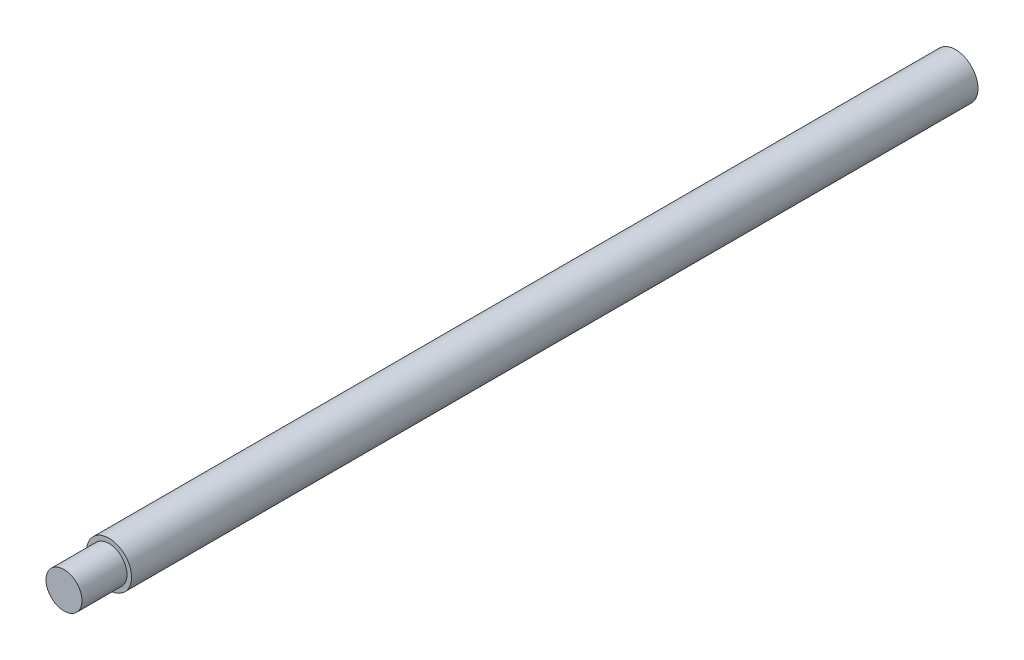
ISO-10303-21;
HEADER;
FILE_DESCRIPTION(('STEP AP214'),'2;1');
FILE_NAME('part.step','',(''),(''),'','','');
FILE_SCHEMA(('AUTOMOTIVE_DESIGN { 1 0 10303 214 1 1 1 1 }'));
ENDSEC;
DATA;
#1=APPLICATION_CONTEXT('core data for automotive mechanical design processes');
#2=APPLICATION_PROTOCOL_DEFINITION('international standard','automotive_design',2000,#1);
#3=PRODUCT_CONTEXT('',#1,'mechanical');
#4=PRODUCT('Part','Part','',(#3));
#5=PRODUCT_RELATED_PRODUCT_CATEGORY('part','',(#4));
#6=PRODUCT_DEFINITION_FORMATION('','',#4);
#7=PRODUCT_DEFINITION_CONTEXT('part definition',#1,'design');
#8=PRODUCT_DEFINITION('design','',#6,#7);
#9=PRODUCT_DEFINITION_SHAPE('','',#8);
#10=(LENGTH_UNIT() NAMED_UNIT(*) SI_UNIT(.MILLI.,.METRE.));
#11=(NAMED_UNIT(*) PLANE_ANGLE_UNIT() SI_UNIT($,.RADIAN.));
#12=(NAMED_UNIT(*) SI_UNIT($,.STERADIAN.) SOLID_ANGLE_UNIT());
#13=UNCERTAINTY_MEASURE_WITH_UNIT(LENGTH_MEASURE(1.E-05),#10,'distance_accuracy_value','');
#14=(GEOMETRIC_REPRESENTATION_CONTEXT(3) GLOBAL_UNCERTAINTY_ASSIGNED_CONTEXT((#13)) GLOBAL_UNIT_ASSIGNED_CONTEXT((#10,
#11,#12)) REPRESENTATION_CONTEXT('',''));
#15=CARTESIAN_POINT('',(0.,0.,0.));
#16=DIRECTION('',(0.,0.,1.));
#17=DIRECTION('',(1.,0.,0.));
#18=AXIS2_PLACEMENT_3D('',#15,#16,#17);
#19=CARTESIAN_POINT('',(0.,0.,198.));
#20=DIRECTION('',(0.,0.,-1.));
#21=DIRECTION('',(-1.,0.,0.));
#22=AXIS2_PLACEMENT_3D('',#19,#20,#21);
#23=CYLINDRICAL_SURFACE('',#22,5.);
#24=CARTESIAN_POINT('',(0.,0.,0.));
#25=DIRECTION('',(0.,0.,1.));
#26=DIRECTION('',(1.,0.,0.));
#27=AXIS2_PLACEMENT_3D('',#24,#25,#26);
#28=CIRCLE('',#27,5.);
#29=CARTESIAN_POINT('',(5.,0.,0.));
#30=VERTEX_POINT('',#29);
#31=EDGE_CURVE('E11',#30,#30,#28,.T.);
#32=ORIENTED_EDGE('',*,*,#31,.T.);
#33=EDGE_LOOP('',(#32));
#34=FACE_BOUND('',#33,.T.);
#35=CARTESIAN_POINT('',(0.,0.,188.));
#36=DIRECTION('',(0.,0.,1.));
#37=DIRECTION('',(1.,0.,0.));
#38=AXIS2_PLACEMENT_3D('',#35,#36,#37);
#39=CIRCLE('',#38,5.);
#40=CARTESIAN_POINT('',(5.,0.,188.));
#41=VERTEX_POINT('',#40);
#42=EDGE_CURVE('E52',#41,#41,#39,.T.);
#43=ORIENTED_EDGE('',*,*,#42,.F.);
#44=EDGE_LOOP('',(#43));
#45=FACE_BOUND('',#44,.T.);
#46=ADVANCED_FACE('F49',(#34,#45),#23,.T.);
#47=CARTESIAN_POINT('',(0.,0.,0.));
#48=DIRECTION('',(0.,0.,1.));
#49=DIRECTION('',(1.,0.,0.));
#50=AXIS2_PLACEMENT_3D('',#47,#48,#49);
#51=PLANE('',#50);
#52=CARTESIAN_POINT('',(0.,0.,0.));
#53=DIRECTION('',(0.,0.,-1.));
#54=DIRECTION('',(-1.,0.,0.));
#55=AXIS2_PLACEMENT_3D('',#52,#53,#54);
#56=CIRCLE('',#55,2.1);
#57=CARTESIAN_POINT('',(-2.1,0.,0.));
#58=VERTEX_POINT('',#57);
#59=EDGE_CURVE('E68',#58,#58,#56,.T.);
#60=ORIENTED_EDGE('',*,*,#59,.F.);
#61=EDGE_LOOP('',(#60));
#62=FACE_BOUND('',#61,.T.);
#63=ORIENTED_EDGE('',*,*,#31,.F.);
#64=EDGE_LOOP('',(#63));
#65=FACE_BOUND('',#64,.T.);
#66=ADVANCED_FACE('F63',(#62,#65),#51,.F.);
#67=CARTESIAN_POINT('',(0.,0.,20.));
#68=DIRECTION('',(0.,0.,-1.));
#69=DIRECTION('',(-1.,0.,0.));
#70=AXIS2_PLACEMENT_3D('',#67,#68,#69);
#71=CONICAL_SURFACE('',#70,2.1,1.02974425867665);
#72=CARTESIAN_POINT('',(0.,0.,21.2618072999579));
#73=VERTEX_POINT('',#72);
#74=VERTEX_LOOP('',#73);
#75=FACE_BOUND('',#74,.T.);
#76=CARTESIAN_POINT('',(0.,0.,20.));
#77=DIRECTION('',(0.,0.,-1.));
#78=DIRECTION('',(-1.,0.,0.));
#79=AXIS2_PLACEMENT_3D('',#76,#77,#78);
#80=CIRCLE('',#79,2.1);
#81=CARTESIAN_POINT('',(-2.1,0.,20.));
#82=VERTEX_POINT('',#81);
#83=EDGE_CURVE('E56',#82,#82,#80,.T.);
#84=ORIENTED_EDGE('',*,*,#83,.T.);
#85=EDGE_LOOP('',(#84));
#86=FACE_BOUND('',#85,.T.);
#87=ADVANCED_FACE('F59',(#75,#86),#71,.F.);
#88=CARTESIAN_POINT('',(0.,0.,0.));
#89=DIRECTION('',(0.,0.,-1.));
#90=DIRECTION('',(-1.,0.,0.));
#91=AXIS2_PLACEMENT_3D('',#88,#89,#90);
#92=CYLINDRICAL_SURFACE('',#91,2.1);
#93=ORIENTED_EDGE('',*,*,#83,.F.);
#94=EDGE_LOOP('',(#93));
#95=FACE_BOUND('',#94,.T.);
#96=ORIENTED_EDGE('',*,*,#59,.T.);
#97=EDGE_LOOP('',(#96));
#98=FACE_BOUND('',#97,.T.);
#99=ADVANCED_FACE('F62',(#95,#98),#92,.F.);
#100=CARTESIAN_POINT('',(0.,0.,188.));
#101=DIRECTION('',(0.,0.,1.));
#102=DIRECTION('',(1.,0.,0.));
#103=AXIS2_PLACEMENT_3D('',#100,#101,#102);
#104=PLANE('',#103);
#105=CARTESIAN_POINT('',(0.,0.,188.));
#106=DIRECTION('',(0.,0.,1.));
#107=DIRECTION('',(1.,0.,0.));
#108=AXIS2_PLACEMENT_3D('',#105,#106,#107);
#109=CIRCLE('',#108,4.);
#110=CARTESIAN_POINT('',(4.,0.,188.));
#111=VERTEX_POINT('',#110);
#112=EDGE_CURVE('E76',#111,#111,#109,.T.);
#113=ORIENTED_EDGE('',*,*,#112,.F.);
#114=EDGE_LOOP('',(#113));
#115=FACE_BOUND('',#114,.T.);
#116=ORIENTED_EDGE('',*,*,#42,.T.);
#117=EDGE_LOOP('',(#116));
#118=FACE_BOUND('',#117,.T.);
#119=ADVANCED_FACE('F83',(#115,#118),#104,.T.);
#120=CARTESIAN_POINT('',(0.,0.,188.));
#121=DIRECTION('',(0.,0.,1.));
#122=DIRECTION('',(1.,0.,0.));
#123=AXIS2_PLACEMENT_3D('',#120,#121,#122);
#124=CYLINDRICAL_SURFACE('',#123,4.);
#125=ORIENTED_EDGE('',*,*,#112,.T.);
#126=EDGE_LOOP('',(#125));
#127=FACE_BOUND('',#126,.T.);
#128=CARTESIAN_POINT('',(0.,0.,198.));
#129=DIRECTION('',(0.,0.,1.));
#130=DIRECTION('',(1.,0.,0.));
#131=AXIS2_PLACEMENT_3D('',#128,#129,#130);
#132=CIRCLE('',#131,4.);
#133=CARTESIAN_POINT('',(4.,0.,198.));
#134=VERTEX_POINT('',#133);
#135=EDGE_CURVE('E73',#134,#134,#132,.T.);
#136=ORIENTED_EDGE('',*,*,#135,.F.);
#137=EDGE_LOOP('',(#136));
#138=FACE_BOUND('',#137,.T.);
#139=ADVANCED_FACE('F102',(#127,#138),#124,.T.);
#140=CARTESIAN_POINT('',(0.,0.,198.));
#141=DIRECTION('',(0.,0.,1.));
#142=DIRECTION('',(1.,0.,0.));
#143=AXIS2_PLACEMENT_3D('',#140,#141,#142);
#144=PLANE('',#143);
#145=ORIENTED_EDGE('',*,*,#135,.T.);
#146=EDGE_LOOP('',(#145));
#147=FACE_BOUND('',#146,.T.);
#148=ADVANCED_FACE('F100',(#147),#144,.T.);
#149=CLOSED_SHELL('',(#46,#66,#87,#99,#119,#139,#148));
#150=MANIFOLD_SOLID_BREP('B2',#149);
#151=ADVANCED_BREP_SHAPE_REPRESENTATION('',(#18,#150),#14);
#152=SHAPE_DEFINITION_REPRESENTATION(#9,#151);
ENDSEC;
END-ISO-10303-21;
